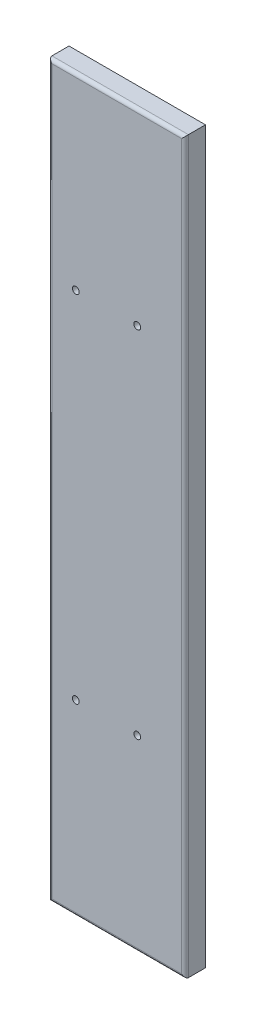
ISO-10303-21;
HEADER;
FILE_DESCRIPTION(('STEP AP214'),'2;1');
FILE_NAME('part.step','',(''),(''),'','','');
FILE_SCHEMA(('AUTOMOTIVE_DESIGN { 1 0 10303 214 1 1 1 1 }'));
ENDSEC;
DATA;
#1=APPLICATION_CONTEXT('core data for automotive mechanical design processes');
#2=APPLICATION_PROTOCOL_DEFINITION('international standard','automotive_design',2000,#1);
#3=PRODUCT_CONTEXT('',#1,'mechanical');
#4=PRODUCT('Part','Part','',(#3));
#5=PRODUCT_RELATED_PRODUCT_CATEGORY('part','',(#4));
#6=PRODUCT_DEFINITION_FORMATION('','',#4);
#7=PRODUCT_DEFINITION_CONTEXT('part definition',#1,'design');
#8=PRODUCT_DEFINITION('design','',#6,#7);
#9=PRODUCT_DEFINITION_SHAPE('','',#8);
#10=(LENGTH_UNIT() NAMED_UNIT(*) SI_UNIT(.MILLI.,.METRE.));
#11=(NAMED_UNIT(*) PLANE_ANGLE_UNIT() SI_UNIT($,.RADIAN.));
#12=(NAMED_UNIT(*) SI_UNIT($,.STERADIAN.) SOLID_ANGLE_UNIT());
#13=UNCERTAINTY_MEASURE_WITH_UNIT(LENGTH_MEASURE(1.E-05),#10,'distance_accuracy_value','');
#14=(GEOMETRIC_REPRESENTATION_CONTEXT(3) GLOBAL_UNCERTAINTY_ASSIGNED_CONTEXT((#13)) GLOBAL_UNIT_ASSIGNED_CONTEXT((#10,
#11,#12)) REPRESENTATION_CONTEXT('',''));
#15=CARTESIAN_POINT('',(0.,0.,0.));
#16=DIRECTION('',(0.,0.,1.));
#17=DIRECTION('',(1.,0.,0.));
#18=AXIS2_PLACEMENT_3D('',#15,#16,#17);
#19=CARTESIAN_POINT('',(-53.9749999999997,174.625,19.05));
#20=DIRECTION('',(0.,1.,0.));
#21=DIRECTION('',(0.,0.,1.));
#22=AXIS2_PLACEMENT_3D('',#19,#20,#21);
#23=PLANE('',#22);
#24=DIRECTION('',(0.,0.,-1.));
#25=VECTOR('',#24,1.);
#26=CARTESIAN_POINT('',(-53.9749999999997,174.625,19.05));
#27=LINE('',#26,#25);
#28=CARTESIAN_POINT('',(-53.9749999999997,174.625,15.875));
#29=VERTEX_POINT('',#28);
#30=CARTESIAN_POINT('',(-53.9749999999997,174.625,0.));
#31=VERTEX_POINT('',#30);
#32=EDGE_CURVE('E121',#29,#31,#27,.T.);
#33=ORIENTED_EDGE('',*,*,#32,.F.);
#34=DIRECTION('',(1.,0.,0.));
#35=VECTOR('',#34,1.);
#36=CARTESIAN_POINT('',(73.0250000000002,174.625,15.875));
#37=LINE('',#36,#35);
#38=CARTESIAN_POINT('',(73.0250000000002,174.625,15.875));
#39=VERTEX_POINT('',#38);
#40=EDGE_CURVE('E98',#29,#39,#37,.T.);
#41=ORIENTED_EDGE('',*,*,#40,.T.);
#42=DIRECTION('',(0.,0.,-1.));
#43=VECTOR('',#42,1.);
#44=CARTESIAN_POINT('',(73.0250000000002,174.625,19.05));
#45=LINE('',#44,#43);
#46=CARTESIAN_POINT('',(73.0250000000002,174.625,0.));
#47=VERTEX_POINT('',#46);
#48=EDGE_CURVE('E91',#39,#47,#45,.T.);
#49=ORIENTED_EDGE('',*,*,#48,.T.);
#50=DIRECTION('',(1.,0.,0.));
#51=VECTOR('',#50,1.);
#52=CARTESIAN_POINT('',(-53.9749999999997,174.625,0.));
#53=LINE('',#52,#51);
#54=EDGE_CURVE('E95',#31,#47,#53,.T.);
#55=ORIENTED_EDGE('',*,*,#54,.F.);
#56=EDGE_LOOP('',(#33,#41,#49,#55));
#57=FACE_BOUND('',#56,.T.);
#58=ADVANCED_FACE('F37',(#57),#23,.T.);
#59=CARTESIAN_POINT('',(-53.9749999999997,-504.825,19.05));
#60=DIRECTION('',(-1.,0.,0.));
#61=DIRECTION('',(0.,0.,1.));
#62=AXIS2_PLACEMENT_3D('',#59,#60,#61);
#63=PLANE('',#62);
#64=DIRECTION('',(0.,0.,-1.));
#65=VECTOR('',#64,1.);
#66=CARTESIAN_POINT('',(-53.9749999999997,-504.825,19.05));
#67=LINE('',#66,#65);
#68=CARTESIAN_POINT('',(-53.9749999999997,-504.825,15.875));
#69=VERTEX_POINT('',#68);
#70=CARTESIAN_POINT('',(-53.9749999999997,-504.825,0.));
#71=VERTEX_POINT('',#70);
#72=EDGE_CURVE('E123',#69,#71,#67,.T.);
#73=ORIENTED_EDGE('',*,*,#72,.F.);
#74=DIRECTION('',(0.,1.,0.));
#75=VECTOR('',#74,1.);
#76=CARTESIAN_POINT('',(-53.9749999999997,174.625,15.875));
#77=LINE('',#76,#75);
#78=EDGE_CURVE('E11',#69,#29,#77,.T.);
#79=ORIENTED_EDGE('',*,*,#78,.T.);
#80=ORIENTED_EDGE('',*,*,#32,.T.);
#81=DIRECTION('',(0.,1.,0.));
#82=VECTOR('',#81,1.);
#83=CARTESIAN_POINT('',(-53.9749999999997,-504.825,0.));
#84=LINE('',#83,#82);
#85=EDGE_CURVE('E100',#71,#31,#84,.T.);
#86=ORIENTED_EDGE('',*,*,#85,.F.);
#87=EDGE_LOOP('',(#73,#79,#80,#86));
#88=FACE_BOUND('',#87,.T.);
#89=ADVANCED_FACE('F203',(#88),#63,.T.);
#90=CARTESIAN_POINT('',(73.0250000000002,-504.825,19.05));
#91=DIRECTION('',(0.,-1.,0.));
#92=DIRECTION('',(0.,0.,-1.));
#93=AXIS2_PLACEMENT_3D('',#90,#91,#92);
#94=PLANE('',#93);
#95=DIRECTION('',(0.,0.,-1.));
#96=VECTOR('',#95,1.);
#97=CARTESIAN_POINT('',(73.0250000000002,-504.825,19.05));
#98=LINE('',#97,#96);
#99=CARTESIAN_POINT('',(73.0250000000002,-504.825,15.875));
#100=VERTEX_POINT('',#99);
#101=CARTESIAN_POINT('',(73.0250000000002,-504.825,0.));
#102=VERTEX_POINT('',#101);
#103=EDGE_CURVE('E99',#100,#102,#98,.T.);
#104=ORIENTED_EDGE('',*,*,#103,.F.);
#105=DIRECTION('',(-1.,0.,0.));
#106=VECTOR('',#105,1.);
#107=CARTESIAN_POINT('',(-53.9749999999997,-504.825,15.875));
#108=LINE('',#107,#106);
#109=EDGE_CURVE('E54',#100,#69,#108,.T.);
#110=ORIENTED_EDGE('',*,*,#109,.T.);
#111=ORIENTED_EDGE('',*,*,#72,.T.);
#112=DIRECTION('',(-1.,0.,0.));
#113=VECTOR('',#112,1.);
#114=CARTESIAN_POINT('',(73.0250000000002,-504.825,0.));
#115=LINE('',#114,#113);
#116=EDGE_CURVE('E108',#102,#71,#115,.T.);
#117=ORIENTED_EDGE('',*,*,#116,.F.);
#118=EDGE_LOOP('',(#104,#110,#111,#117));
#119=FACE_BOUND('',#118,.T.);
#120=ADVANCED_FACE('F198',(#119),#94,.T.);
#121=CARTESIAN_POINT('',(73.0250000000002,174.625,19.05));
#122=DIRECTION('',(1.,0.,0.));
#123=DIRECTION('',(0.,0.,-1.));
#124=AXIS2_PLACEMENT_3D('',#121,#122,#123);
#125=PLANE('',#124);
#126=ORIENTED_EDGE('',*,*,#48,.F.);
#127=DIRECTION('',(0.,-1.,0.));
#128=VECTOR('',#127,1.);
#129=CARTESIAN_POINT('',(73.0250000000002,-504.825,15.875));
#130=LINE('',#129,#128);
#131=EDGE_CURVE('E46',#39,#100,#130,.T.);
#132=ORIENTED_EDGE('',*,*,#131,.T.);
#133=ORIENTED_EDGE('',*,*,#103,.T.);
#134=DIRECTION('',(0.,-1.,0.));
#135=VECTOR('',#134,1.);
#136=CARTESIAN_POINT('',(73.0250000000002,174.625,0.));
#137=LINE('',#136,#135);
#138=EDGE_CURVE('E103',#47,#102,#137,.T.);
#139=ORIENTED_EDGE('',*,*,#138,.F.);
#140=EDGE_LOOP('',(#126,#132,#133,#139));
#141=FACE_BOUND('',#140,.T.);
#142=ADVANCED_FACE('F104',(#141),#125,.T.);
#143=CARTESIAN_POINT('',(0.,0.,19.05));
#144=DIRECTION('',(0.,0.,-1.));
#145=DIRECTION('',(-1.,0.,0.));
#146=AXIS2_PLACEMENT_3D('',#143,#144,#145);
#147=PLANE('',#146);
#148=DIRECTION('',(-1.,0.,0.));
#149=VECTOR('',#148,1.);
#150=CARTESIAN_POINT('',(73.0250000000002,-501.65,19.05));
#151=LINE('',#150,#149);
#152=CARTESIAN_POINT('',(-50.7999999999997,-501.65,19.05));
#153=VERTEX_POINT('',#152);
#154=CARTESIAN_POINT('',(69.8500000000002,-501.65,19.05));
#155=VERTEX_POINT('',#154);
#156=EDGE_CURVE('E129',#153,#155,#151,.F.);
#157=ORIENTED_EDGE('',*,*,#156,.T.);
#158=DIRECTION('',(0.,-1.,0.));
#159=VECTOR('',#158,1.);
#160=CARTESIAN_POINT('',(69.8500000000002,174.625,19.05));
#161=LINE('',#160,#159);
#162=CARTESIAN_POINT('',(69.8500000000002,171.45,19.05));
#163=VERTEX_POINT('',#162);
#164=EDGE_CURVE('E134',#155,#163,#161,.F.);
#165=ORIENTED_EDGE('',*,*,#164,.T.);
#166=DIRECTION('',(1.,0.,0.));
#167=VECTOR('',#166,1.);
#168=CARTESIAN_POINT('',(-53.9749999999997,171.45,19.05));
#169=LINE('',#168,#167);
#170=CARTESIAN_POINT('',(-50.7999999999997,171.45,19.05));
#171=VERTEX_POINT('',#170);
#172=EDGE_CURVE('E131',#163,#171,#169,.F.);
#173=ORIENTED_EDGE('',*,*,#172,.T.);
#174=DIRECTION('',(0.,1.,0.));
#175=VECTOR('',#174,1.);
#176=CARTESIAN_POINT('',(-50.7999999999997,-504.825,19.05));
#177=LINE('',#176,#175);
#178=EDGE_CURVE('E127',#171,#153,#177,.F.);
#179=ORIENTED_EDGE('',*,*,#178,.T.);
#180=EDGE_LOOP('',(#157,#165,#173,#179));
#181=FACE_BOUND('',#180,.T.);
#182=CARTESIAN_POINT('',(-28.5750001146122,-330.2,19.05));
#183=DIRECTION('',(0.,0.,1.));
#184=DIRECTION('',(1.,0.,0.));
#185=AXIS2_PLACEMENT_3D('',#182,#183,#184);
#186=CIRCLE('',#185,3.17499999999999);
#187=CARTESIAN_POINT('',(-25.4000001146122,-330.2,19.05));
#188=VERTEX_POINT('',#187);
#189=EDGE_CURVE('E153',#188,#188,#186,.T.);
#190=ORIENTED_EDGE('',*,*,#189,.F.);
#191=EDGE_LOOP('',(#190));
#192=FACE_BOUND('',#191,.T.);
#193=CARTESIAN_POINT('',(28.5749998853878,-330.2,19.05));
#194=DIRECTION('',(0.,0.,1.));
#195=DIRECTION('',(1.,0.,0.));
#196=AXIS2_PLACEMENT_3D('',#193,#194,#195);
#197=CIRCLE('',#196,3.17499999999998);
#198=CARTESIAN_POINT('',(31.7499998853878,-330.2,19.05));
#199=VERTEX_POINT('',#198);
#200=EDGE_CURVE('E166',#199,#199,#197,.T.);
#201=ORIENTED_EDGE('',*,*,#200,.F.);
#202=EDGE_LOOP('',(#201));
#203=FACE_BOUND('',#202,.T.);
#204=CARTESIAN_POINT('',(-28.5749999999997,0.,19.05));
#205=DIRECTION('',(0.,0.,1.));
#206=DIRECTION('',(1.,0.,0.));
#207=AXIS2_PLACEMENT_3D('',#204,#205,#206);
#208=CIRCLE('',#207,3.17499999999999);
#209=CARTESIAN_POINT('',(-25.3999999999997,0.,19.05));
#210=VERTEX_POINT('',#209);
#211=EDGE_CURVE('E175',#210,#210,#208,.T.);
#212=ORIENTED_EDGE('',*,*,#211,.F.);
#213=EDGE_LOOP('',(#212));
#214=FACE_BOUND('',#213,.T.);
#215=CARTESIAN_POINT('',(28.5750000000003,0.,19.05));
#216=DIRECTION('',(0.,0.,1.));
#217=DIRECTION('',(1.,0.,0.));
#218=AXIS2_PLACEMENT_3D('',#215,#216,#217);
#219=CIRCLE('',#218,3.17499999999998);
#220=CARTESIAN_POINT('',(31.7500000000003,0.,19.05));
#221=VERTEX_POINT('',#220);
#222=EDGE_CURVE('E115',#221,#221,#219,.T.);
#223=ORIENTED_EDGE('',*,*,#222,.F.);
#224=EDGE_LOOP('',(#223));
#225=FACE_BOUND('',#224,.T.);
#226=ADVANCED_FACE('F188',(#181,#192,#203,#214,#225),#147,.F.);
#227=CARTESIAN_POINT('',(0.,0.,0.));
#228=DIRECTION('',(0.,0.,-1.));
#229=DIRECTION('',(-1.,0.,0.));
#230=AXIS2_PLACEMENT_3D('',#227,#228,#229);
#231=PLANE('',#230);
#232=CARTESIAN_POINT('',(-28.5750001146122,-330.2,0.));
#233=DIRECTION('',(0.,0.,1.));
#234=DIRECTION('',(1.,0.,0.));
#235=AXIS2_PLACEMENT_3D('',#232,#233,#234);
#236=CIRCLE('',#235,3.937);
#237=CARTESIAN_POINT('',(-24.6380001146122,-330.2,0.));
#238=VERTEX_POINT('',#237);
#239=EDGE_CURVE('E147',#238,#238,#236,.T.);
#240=ORIENTED_EDGE('',*,*,#239,.T.);
#241=EDGE_LOOP('',(#240));
#242=FACE_BOUND('',#241,.T.);
#243=CARTESIAN_POINT('',(28.5749998853878,-330.2,0.));
#244=DIRECTION('',(0.,0.,1.));
#245=DIRECTION('',(1.,0.,0.));
#246=AXIS2_PLACEMENT_3D('',#243,#244,#245);
#247=CIRCLE('',#246,3.937);
#248=CARTESIAN_POINT('',(32.5119998853878,-330.2,0.));
#249=VERTEX_POINT('',#248);
#250=EDGE_CURVE('E163',#249,#249,#247,.T.);
#251=ORIENTED_EDGE('',*,*,#250,.T.);
#252=EDGE_LOOP('',(#251));
#253=FACE_BOUND('',#252,.T.);
#254=CARTESIAN_POINT('',(-28.5749999999997,0.,0.));
#255=DIRECTION('',(0.,0.,1.));
#256=DIRECTION('',(1.,0.,0.));
#257=AXIS2_PLACEMENT_3D('',#254,#255,#256);
#258=CIRCLE('',#257,3.937);
#259=CARTESIAN_POINT('',(-24.6379999999997,0.,0.));
#260=VERTEX_POINT('',#259);
#261=EDGE_CURVE('E172',#260,#260,#258,.T.);
#262=ORIENTED_EDGE('',*,*,#261,.T.);
#263=EDGE_LOOP('',(#262));
#264=FACE_BOUND('',#263,.T.);
#265=CARTESIAN_POINT('',(28.5750000000003,0.,0.));
#266=DIRECTION('',(0.,0.,1.));
#267=DIRECTION('',(1.,0.,0.));
#268=AXIS2_PLACEMENT_3D('',#265,#266,#267);
#269=CIRCLE('',#268,3.937);
#270=CARTESIAN_POINT('',(32.5120000000003,0.,0.));
#271=VERTEX_POINT('',#270);
#272=EDGE_CURVE('E181',#271,#271,#269,.T.);
#273=ORIENTED_EDGE('',*,*,#272,.T.);
#274=EDGE_LOOP('',(#273));
#275=FACE_BOUND('',#274,.T.);
#276=ORIENTED_EDGE('',*,*,#54,.T.);
#277=ORIENTED_EDGE('',*,*,#138,.T.);
#278=ORIENTED_EDGE('',*,*,#116,.T.);
#279=ORIENTED_EDGE('',*,*,#85,.T.);
#280=EDGE_LOOP('',(#276,#277,#278,#279));
#281=FACE_BOUND('',#280,.T.);
#282=ADVANCED_FACE('F110',(#242,#253,#264,#275,#281),#231,.T.);
#283=CARTESIAN_POINT('',(28.5750000000003,0.,0.876580726302405));
#284=DIRECTION('',(0.,0.,-1.));
#285=DIRECTION('',(-1.,0.,0.));
#286=AXIS2_PLACEMENT_3D('',#283,#284,#285);
#287=CONICAL_SURFACE('',#286,3.175,0.715584993317678);
#288=ORIENTED_EDGE('',*,*,#272,.F.);
#289=EDGE_LOOP('',(#288));
#290=FACE_BOUND('',#289,.T.);
#291=CARTESIAN_POINT('',(28.5750000000003,0.,0.876580726302405));
#292=DIRECTION('',(0.,0.,1.));
#293=DIRECTION('',(1.,0.,0.));
#294=AXIS2_PLACEMENT_3D('',#291,#292,#293);
#295=CIRCLE('',#294,3.175);
#296=CARTESIAN_POINT('',(31.7500000000003,0.,0.876580726302405));
#297=VERTEX_POINT('',#296);
#298=EDGE_CURVE('E112',#297,#297,#295,.T.);
#299=ORIENTED_EDGE('',*,*,#298,.T.);
#300=EDGE_LOOP('',(#299));
#301=FACE_BOUND('',#300,.T.);
#302=ADVANCED_FACE('F196',(#290,#301),#287,.F.);
#303=CARTESIAN_POINT('',(28.5750000000003,0.,19.05));
#304=DIRECTION('',(0.,0.,1.));
#305=DIRECTION('',(1.,0.,0.));
#306=AXIS2_PLACEMENT_3D('',#303,#304,#305);
#307=CYLINDRICAL_SURFACE('',#306,3.17499999999999);
#308=ORIENTED_EDGE('',*,*,#298,.F.);
#309=EDGE_LOOP('',(#308));
#310=FACE_BOUND('',#309,.T.);
#311=ORIENTED_EDGE('',*,*,#222,.T.);
#312=EDGE_LOOP('',(#311));
#313=FACE_BOUND('',#312,.T.);
#314=ADVANCED_FACE('F186',(#310,#313),#307,.F.);
#315=CARTESIAN_POINT('',(-28.5749999999997,0.,0.876580726302405));
#316=DIRECTION('',(0.,0.,-1.));
#317=DIRECTION('',(-1.,0.,0.));
#318=AXIS2_PLACEMENT_3D('',#315,#316,#317);
#319=CONICAL_SURFACE('',#318,3.175,0.715584993317678);
#320=ORIENTED_EDGE('',*,*,#261,.F.);
#321=EDGE_LOOP('',(#320));
#322=FACE_BOUND('',#321,.T.);
#323=CARTESIAN_POINT('',(-28.5749999999997,0.,0.876580726302405));
#324=DIRECTION('',(0.,0.,1.));
#325=DIRECTION('',(1.,0.,0.));
#326=AXIS2_PLACEMENT_3D('',#323,#324,#325);
#327=CIRCLE('',#326,3.175);
#328=CARTESIAN_POINT('',(-25.3999999999997,0.,0.876580726302405));
#329=VERTEX_POINT('',#328);
#330=EDGE_CURVE('E178',#329,#329,#327,.T.);
#331=ORIENTED_EDGE('',*,*,#330,.T.);
#332=EDGE_LOOP('',(#331));
#333=FACE_BOUND('',#332,.T.);
#334=ADVANCED_FACE('F324',(#322,#333),#319,.F.);
#335=CARTESIAN_POINT('',(-28.5749999999997,0.,19.05));
#336=DIRECTION('',(0.,0.,1.));
#337=DIRECTION('',(1.,0.,0.));
#338=AXIS2_PLACEMENT_3D('',#335,#336,#337);
#339=CYLINDRICAL_SURFACE('',#338,3.17499999999999);
#340=ORIENTED_EDGE('',*,*,#330,.F.);
#341=EDGE_LOOP('',(#340));
#342=FACE_BOUND('',#341,.T.);
#343=ORIENTED_EDGE('',*,*,#211,.T.);
#344=EDGE_LOOP('',(#343));
#345=FACE_BOUND('',#344,.T.);
#346=ADVANCED_FACE('F314',(#342,#345),#339,.F.);
#347=CARTESIAN_POINT('',(28.5749998853878,-330.2,0.876580726302405));
#348=DIRECTION('',(0.,0.,-1.));
#349=DIRECTION('',(-1.,0.,0.));
#350=AXIS2_PLACEMENT_3D('',#347,#348,#349);
#351=CONICAL_SURFACE('',#350,3.175,0.715584993317678);
#352=ORIENTED_EDGE('',*,*,#250,.F.);
#353=EDGE_LOOP('',(#352));
#354=FACE_BOUND('',#353,.T.);
#355=CARTESIAN_POINT('',(28.5749998853878,-330.2,0.876580726302405));
#356=DIRECTION('',(0.,0.,1.));
#357=DIRECTION('',(1.,0.,0.));
#358=AXIS2_PLACEMENT_3D('',#355,#356,#357);
#359=CIRCLE('',#358,3.175);
#360=CARTESIAN_POINT('',(31.7499998853878,-330.2,0.876580726302405));
#361=VERTEX_POINT('',#360);
#362=EDGE_CURVE('E169',#361,#361,#359,.T.);
#363=ORIENTED_EDGE('',*,*,#362,.T.);
#364=EDGE_LOOP('',(#363));
#365=FACE_BOUND('',#364,.T.);
#366=ADVANCED_FACE('F304',(#354,#365),#351,.F.);
#367=CARTESIAN_POINT('',(28.5749998853878,-330.2,19.05));
#368=DIRECTION('',(0.,0.,1.));
#369=DIRECTION('',(1.,0.,0.));
#370=AXIS2_PLACEMENT_3D('',#367,#368,#369);
#371=CYLINDRICAL_SURFACE('',#370,3.17499999999999);
#372=ORIENTED_EDGE('',*,*,#362,.F.);
#373=EDGE_LOOP('',(#372));
#374=FACE_BOUND('',#373,.T.);
#375=ORIENTED_EDGE('',*,*,#200,.T.);
#376=EDGE_LOOP('',(#375));
#377=FACE_BOUND('',#376,.T.);
#378=ADVANCED_FACE('F294',(#374,#377),#371,.F.);
#379=CARTESIAN_POINT('',(-28.5750001146122,-330.2,0.876580726302405));
#380=DIRECTION('',(0.,0.,-1.));
#381=DIRECTION('',(-1.,0.,0.));
#382=AXIS2_PLACEMENT_3D('',#379,#380,#381);
#383=CONICAL_SURFACE('',#382,3.175,0.715584993317678);
#384=ORIENTED_EDGE('',*,*,#239,.F.);
#385=EDGE_LOOP('',(#384));
#386=FACE_BOUND('',#385,.T.);
#387=CARTESIAN_POINT('',(-28.5750001146122,-330.2,0.876580726302405));
#388=DIRECTION('',(0.,0.,1.));
#389=DIRECTION('',(1.,0.,0.));
#390=AXIS2_PLACEMENT_3D('',#387,#388,#389);
#391=CIRCLE('',#390,3.175);
#392=CARTESIAN_POINT('',(-25.4000001146122,-330.2,0.876580726302405));
#393=VERTEX_POINT('',#392);
#394=EDGE_CURVE('E158',#393,#393,#391,.T.);
#395=ORIENTED_EDGE('',*,*,#394,.T.);
#396=EDGE_LOOP('',(#395));
#397=FACE_BOUND('',#396,.T.);
#398=ADVANCED_FACE('F228',(#386,#397),#383,.F.);
#399=CARTESIAN_POINT('',(-28.5750001146122,-330.2,19.05));
#400=DIRECTION('',(0.,0.,1.));
#401=DIRECTION('',(1.,0.,0.));
#402=AXIS2_PLACEMENT_3D('',#399,#400,#401);
#403=CYLINDRICAL_SURFACE('',#402,3.17499999999999);
#404=ORIENTED_EDGE('',*,*,#394,.F.);
#405=EDGE_LOOP('',(#404));
#406=FACE_BOUND('',#405,.T.);
#407=ORIENTED_EDGE('',*,*,#189,.T.);
#408=EDGE_LOOP('',(#407));
#409=FACE_BOUND('',#408,.T.);
#410=ADVANCED_FACE('F223',(#406,#409),#403,.F.);
#411=CARTESIAN_POINT('',(73.0250000000002,-501.65,15.875));
#412=DIRECTION('',(1.,0.,0.));
#413=DIRECTION('',(0.,0.,-1.));
#414=AXIS2_PLACEMENT_3D('',#411,#412,#413);
#415=CYLINDRICAL_SURFACE('',#414,3.175);
#416=CARTESIAN_POINT('',(69.8500000000002,-501.65,15.875));
#417=DIRECTION('',(0.707106781186547,0.707106781186547,0.));
#418=DIRECTION('',(-0.707106781186547,0.707106781186547,0.));
#419=AXIS2_PLACEMENT_3D('',#416,#417,#418);
#420=ELLIPSE('',#419,4.49012806053458,3.175);
#421=EDGE_CURVE('E141',#155,#100,#420,.T.);
#422=ORIENTED_EDGE('',*,*,#421,.F.);
#423=ORIENTED_EDGE('',*,*,#156,.F.);
#424=CARTESIAN_POINT('',(-50.7999999999997,-501.65,15.875));
#425=DIRECTION('',(0.707106781186547,-0.707106781186547,0.));
#426=DIRECTION('',(-0.707106781186547,-0.707106781186547,0.));
#427=AXIS2_PLACEMENT_3D('',#424,#425,#426);
#428=ELLIPSE('',#427,4.49012806053458,3.175);
#429=EDGE_CURVE('E41',#69,#153,#428,.F.);
#430=ORIENTED_EDGE('',*,*,#429,.F.);
#431=ORIENTED_EDGE('',*,*,#109,.F.);
#432=EDGE_LOOP('',(#422,#423,#430,#431));
#433=FACE_BOUND('',#432,.T.);
#434=ADVANCED_FACE('F39',(#433),#415,.T.);
#435=CARTESIAN_POINT('',(-50.7999999999997,-504.825,15.875));
#436=DIRECTION('',(0.,-1.,0.));
#437=DIRECTION('',(0.,0.,-1.));
#438=AXIS2_PLACEMENT_3D('',#435,#436,#437);
#439=CYLINDRICAL_SURFACE('',#438,3.175);
#440=ORIENTED_EDGE('',*,*,#429,.T.);
#441=ORIENTED_EDGE('',*,*,#178,.F.);
#442=CARTESIAN_POINT('',(-50.7999999999997,171.45,15.875));
#443=DIRECTION('',(-0.707106781186547,-0.707106781186547,0.));
#444=DIRECTION('',(0.707106781186547,-0.707106781186547,0.));
#445=AXIS2_PLACEMENT_3D('',#442,#443,#444);
#446=ELLIPSE('',#445,4.49012806053458,3.175);
#447=EDGE_CURVE('E140',#29,#171,#446,.F.);
#448=ORIENTED_EDGE('',*,*,#447,.F.);
#449=ORIENTED_EDGE('',*,*,#78,.F.);
#450=EDGE_LOOP('',(#440,#441,#448,#449));
#451=FACE_BOUND('',#450,.T.);
#452=ADVANCED_FACE('F218',(#451),#439,.T.);
#453=CARTESIAN_POINT('',(69.8500000000002,174.625,15.875));
#454=DIRECTION('',(0.,1.,0.));
#455=DIRECTION('',(0.,0.,1.));
#456=AXIS2_PLACEMENT_3D('',#453,#454,#455);
#457=CYLINDRICAL_SURFACE('',#456,3.175);
#458=ORIENTED_EDGE('',*,*,#421,.T.);
#459=ORIENTED_EDGE('',*,*,#131,.F.);
#460=CARTESIAN_POINT('',(69.8500000000002,171.45,15.875));
#461=DIRECTION('',(-0.707106781186547,0.707106781186547,0.));
#462=DIRECTION('',(0.707106781186547,0.707106781186547,0.));
#463=AXIS2_PLACEMENT_3D('',#460,#461,#462);
#464=ELLIPSE('',#463,4.49012806053458,3.175);
#465=EDGE_CURVE('E138',#163,#39,#464,.T.);
#466=ORIENTED_EDGE('',*,*,#465,.F.);
#467=ORIENTED_EDGE('',*,*,#164,.F.);
#468=EDGE_LOOP('',(#458,#459,#466,#467));
#469=FACE_BOUND('',#468,.T.);
#470=ADVANCED_FACE('F215',(#469),#457,.T.);
#471=CARTESIAN_POINT('',(-53.9749999999997,171.45,15.875));
#472=DIRECTION('',(-1.,0.,0.));
#473=DIRECTION('',(0.,0.,1.));
#474=AXIS2_PLACEMENT_3D('',#471,#472,#473);
#475=CYLINDRICAL_SURFACE('',#474,3.175);
#476=ORIENTED_EDGE('',*,*,#447,.T.);
#477=ORIENTED_EDGE('',*,*,#172,.F.);
#478=ORIENTED_EDGE('',*,*,#465,.T.);
#479=ORIENTED_EDGE('',*,*,#40,.F.);
#480=EDGE_LOOP('',(#476,#477,#478,#479));
#481=FACE_BOUND('',#480,.T.);
#482=ADVANCED_FACE('F212',(#481),#475,.T.);
#483=CLOSED_SHELL('',(#58,#89,#120,#142,#226,#282,#302,#314,#334,#346,#366,#378,#398,#410,#434,
#452,#470,#482));
#484=MANIFOLD_SOLID_BREP('B2',#483);
#485=ADVANCED_BREP_SHAPE_REPRESENTATION('',(#18,#484),#14);
#486=SHAPE_DEFINITION_REPRESENTATION(#9,#485);
ENDSEC;
END-ISO-10303-21;
